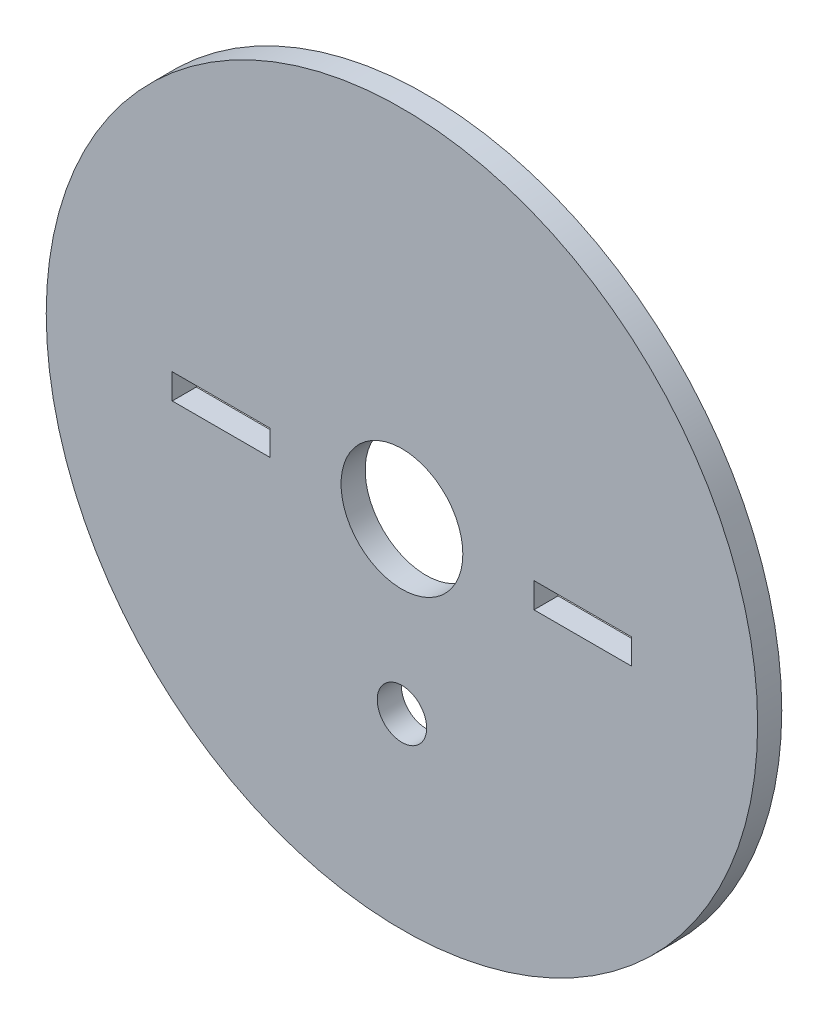
ISO-10303-21;
HEADER;
FILE_DESCRIPTION(('STEP AP214'),'2;1');
FILE_NAME('part.step','',(''),(''),'','','');
FILE_SCHEMA(('AUTOMOTIVE_DESIGN { 1 0 10303 214 1 1 1 1 }'));
ENDSEC;
DATA;
#1=APPLICATION_CONTEXT('core data for automotive mechanical design processes');
#2=APPLICATION_PROTOCOL_DEFINITION('international standard','automotive_design',2000,#1);
#3=PRODUCT_CONTEXT('',#1,'mechanical');
#4=PRODUCT('Part','Part','',(#3));
#5=PRODUCT_RELATED_PRODUCT_CATEGORY('part','',(#4));
#6=PRODUCT_DEFINITION_FORMATION('','',#4);
#7=PRODUCT_DEFINITION_CONTEXT('part definition',#1,'design');
#8=PRODUCT_DEFINITION('design','',#6,#7);
#9=PRODUCT_DEFINITION_SHAPE('','',#8);
#10=(LENGTH_UNIT() NAMED_UNIT(*) SI_UNIT(.MILLI.,.METRE.));
#11=(NAMED_UNIT(*) PLANE_ANGLE_UNIT() SI_UNIT($,.RADIAN.));
#12=(NAMED_UNIT(*) SI_UNIT($,.STERADIAN.) SOLID_ANGLE_UNIT());
#13=UNCERTAINTY_MEASURE_WITH_UNIT(LENGTH_MEASURE(1.E-05),#10,'distance_accuracy_value','');
#14=(GEOMETRIC_REPRESENTATION_CONTEXT(3) GLOBAL_UNCERTAINTY_ASSIGNED_CONTEXT((#13)) GLOBAL_UNIT_ASSIGNED_CONTEXT((#10,
#11,#12)) REPRESENTATION_CONTEXT('',''));
#15=CARTESIAN_POINT('',(0.,0.,0.));
#16=DIRECTION('',(0.,0.,1.));
#17=DIRECTION('',(1.,0.,0.));
#18=AXIS2_PLACEMENT_3D('',#15,#16,#17);
#19=CARTESIAN_POINT('',(0.,14.,2.));
#20=DIRECTION('',(0.,0.,1.));
#21=DIRECTION('',(1.,0.,0.));
#22=AXIS2_PLACEMENT_3D('',#19,#20,#21);
#23=PLANE('',#22);
#24=DIRECTION('',(0.,-1.,0.));
#25=VECTOR('',#24,1.);
#26=CARTESIAN_POINT('',(10.95,15.05,2.));
#27=LINE('',#26,#25);
#28=CARTESIAN_POINT('',(10.95,15.05,2.));
#29=VERTEX_POINT('',#28);
#30=CARTESIAN_POINT('',(10.95,12.95,2.));
#31=VERTEX_POINT('',#30);
#32=EDGE_CURVE('E108',#29,#31,#27,.T.);
#33=ORIENTED_EDGE('',*,*,#32,.F.);
#34=DIRECTION('',(-1.,0.,0.));
#35=VECTOR('',#34,1.);
#36=CARTESIAN_POINT('',(19.05,15.05,2.));
#37=LINE('',#36,#35);
#38=CARTESIAN_POINT('',(19.05,15.05,2.));
#39=VERTEX_POINT('',#38);
#40=EDGE_CURVE('E100',#39,#29,#37,.T.);
#41=ORIENTED_EDGE('',*,*,#40,.F.);
#42=DIRECTION('',(0.,1.,0.));
#43=VECTOR('',#42,1.);
#44=CARTESIAN_POINT('',(19.05,15.05,2.));
#45=LINE('',#44,#43);
#46=CARTESIAN_POINT('',(19.05,12.95,2.));
#47=VERTEX_POINT('',#46);
#48=EDGE_CURVE('E123',#47,#39,#45,.T.);
#49=ORIENTED_EDGE('',*,*,#48,.F.);
#50=DIRECTION('',(1.,0.,0.));
#51=VECTOR('',#50,1.);
#52=CARTESIAN_POINT('',(19.05,12.95,2.));
#53=LINE('',#52,#51);
#54=EDGE_CURVE('E121',#31,#47,#53,.T.);
#55=ORIENTED_EDGE('',*,*,#54,.F.);
#56=EDGE_LOOP('',(#33,#41,#49,#55));
#57=FACE_BOUND('',#56,.T.);
#58=DIRECTION('',(-1.,0.,0.));
#59=VECTOR('',#58,1.);
#60=CARTESIAN_POINT('',(-19.05,15.05,2.));
#61=LINE('',#60,#59);
#62=CARTESIAN_POINT('',(-10.95,15.05,2.));
#63=VERTEX_POINT('',#62);
#64=CARTESIAN_POINT('',(-19.05,15.05,2.));
#65=VERTEX_POINT('',#64);
#66=EDGE_CURVE('E141',#63,#65,#61,.T.);
#67=ORIENTED_EDGE('',*,*,#66,.F.);
#68=DIRECTION('',(0.,1.,0.));
#69=VECTOR('',#68,1.);
#70=CARTESIAN_POINT('',(-10.95,15.05,2.));
#71=LINE('',#70,#69);
#72=CARTESIAN_POINT('',(-10.95,12.95,2.));
#73=VERTEX_POINT('',#72);
#74=EDGE_CURVE('E139',#73,#63,#71,.T.);
#75=ORIENTED_EDGE('',*,*,#74,.F.);
#76=DIRECTION('',(1.,0.,0.));
#77=VECTOR('',#76,1.);
#78=CARTESIAN_POINT('',(-19.05,12.95,2.));
#79=LINE('',#78,#77);
#80=CARTESIAN_POINT('',(-19.05,12.95,2.));
#81=VERTEX_POINT('',#80);
#82=EDGE_CURVE('E147',#81,#73,#79,.T.);
#83=ORIENTED_EDGE('',*,*,#82,.F.);
#84=DIRECTION('',(0.,-1.,0.));
#85=VECTOR('',#84,1.);
#86=CARTESIAN_POINT('',(-19.05,15.05,2.));
#87=LINE('',#86,#85);
#88=EDGE_CURVE('E144',#65,#81,#87,.T.);
#89=ORIENTED_EDGE('',*,*,#88,.F.);
#90=EDGE_LOOP('',(#67,#75,#83,#89));
#91=FACE_BOUND('',#90,.T.);
#92=CARTESIAN_POINT('',(0.,0.,2.));
#93=DIRECTION('',(0.,0.,1.));
#94=DIRECTION('',(1.,0.,0.));
#95=AXIS2_PLACEMENT_3D('',#92,#93,#94);
#96=CIRCLE('',#95,2.05);
#97=CARTESIAN_POINT('',(2.05,0.,2.));
#98=VERTEX_POINT('',#97);
#99=EDGE_CURVE('E170',#98,#98,#96,.T.);
#100=ORIENTED_EDGE('',*,*,#99,.F.);
#101=EDGE_LOOP('',(#100));
#102=FACE_BOUND('',#101,.T.);
#103=CARTESIAN_POINT('',(0.,14.,2.));
#104=DIRECTION('',(0.,0.,1.));
#105=DIRECTION('',(1.,0.,0.));
#106=AXIS2_PLACEMENT_3D('',#103,#104,#105);
#107=CIRCLE('',#106,29.5);
#108=CARTESIAN_POINT('',(29.5,14.,2.));
#109=VERTEX_POINT('',#108);
#110=EDGE_CURVE('E11',#109,#109,#107,.T.);
#111=ORIENTED_EDGE('',*,*,#110,.T.);
#112=EDGE_LOOP('',(#111));
#113=FACE_BOUND('',#112,.T.);
#114=CARTESIAN_POINT('',(0.,14.,2.));
#115=DIRECTION('',(0.,0.,1.));
#116=DIRECTION('',(1.,0.,0.));
#117=AXIS2_PLACEMENT_3D('',#114,#115,#116);
#118=CIRCLE('',#117,5.05);
#119=CARTESIAN_POINT('',(5.05,14.,2.));
#120=VERTEX_POINT('',#119);
#121=EDGE_CURVE('E129',#120,#120,#118,.T.);
#122=ORIENTED_EDGE('',*,*,#121,.F.);
#123=EDGE_LOOP('',(#122));
#124=FACE_BOUND('',#123,.T.);
#125=ADVANCED_FACE('F35',(#57,#91,#102,#113,#124),#23,.T.);
#126=CARTESIAN_POINT('',(0.,14.,0.));
#127=DIRECTION('',(0.,0.,1.));
#128=DIRECTION('',(1.,0.,0.));
#129=AXIS2_PLACEMENT_3D('',#126,#127,#128);
#130=PLANE('',#129);
#131=DIRECTION('',(0.,1.,0.));
#132=VECTOR('',#131,1.);
#133=CARTESIAN_POINT('',(-10.95,15.05,0.));
#134=LINE('',#133,#132);
#135=CARTESIAN_POINT('',(-10.95,12.95,0.));
#136=VERTEX_POINT('',#135);
#137=CARTESIAN_POINT('',(-10.95,15.05,0.));
#138=VERTEX_POINT('',#137);
#139=EDGE_CURVE('E116',#136,#138,#134,.T.);
#140=ORIENTED_EDGE('',*,*,#139,.T.);
#141=DIRECTION('',(-1.,0.,0.));
#142=VECTOR('',#141,1.);
#143=CARTESIAN_POINT('',(-19.05,15.05,0.));
#144=LINE('',#143,#142);
#145=CARTESIAN_POINT('',(-19.05,15.05,0.));
#146=VERTEX_POINT('',#145);
#147=EDGE_CURVE('E152',#138,#146,#144,.T.);
#148=ORIENTED_EDGE('',*,*,#147,.T.);
#149=DIRECTION('',(0.,-1.,0.));
#150=VECTOR('',#149,1.);
#151=CARTESIAN_POINT('',(-19.05,15.05,0.));
#152=LINE('',#151,#150);
#153=CARTESIAN_POINT('',(-19.05,12.95,0.));
#154=VERTEX_POINT('',#153);
#155=EDGE_CURVE('E155',#146,#154,#152,.T.);
#156=ORIENTED_EDGE('',*,*,#155,.T.);
#157=DIRECTION('',(1.,0.,0.));
#158=VECTOR('',#157,1.);
#159=CARTESIAN_POINT('',(-19.05,12.95,0.));
#160=LINE('',#159,#158);
#161=EDGE_CURVE('E142',#154,#136,#160,.T.);
#162=ORIENTED_EDGE('',*,*,#161,.T.);
#163=EDGE_LOOP('',(#140,#148,#156,#162));
#164=FACE_BOUND('',#163,.T.);
#165=CARTESIAN_POINT('',(0.,14.,0.));
#166=DIRECTION('',(0.,0.,1.));
#167=DIRECTION('',(1.,0.,0.));
#168=AXIS2_PLACEMENT_3D('',#165,#166,#167);
#169=CIRCLE('',#168,29.5);
#170=CARTESIAN_POINT('',(29.5,14.,0.));
#171=VERTEX_POINT('',#170);
#172=EDGE_CURVE('E39',#171,#171,#169,.T.);
#173=ORIENTED_EDGE('',*,*,#172,.F.);
#174=EDGE_LOOP('',(#173));
#175=FACE_BOUND('',#174,.T.);
#176=CARTESIAN_POINT('',(0.,0.,0.));
#177=DIRECTION('',(0.,0.,1.));
#178=DIRECTION('',(1.,0.,0.));
#179=AXIS2_PLACEMENT_3D('',#176,#177,#178);
#180=CIRCLE('',#179,2.05);
#181=CARTESIAN_POINT('',(2.05,0.,0.));
#182=VERTEX_POINT('',#181);
#183=EDGE_CURVE('E169',#182,#182,#180,.T.);
#184=ORIENTED_EDGE('',*,*,#183,.T.);
#185=EDGE_LOOP('',(#184));
#186=FACE_BOUND('',#185,.T.);
#187=DIRECTION('',(-1.,0.,0.));
#188=VECTOR('',#187,1.);
#189=CARTESIAN_POINT('',(19.05,15.05,0.));
#190=LINE('',#189,#188);
#191=CARTESIAN_POINT('',(19.05,15.05,0.));
#192=VERTEX_POINT('',#191);
#193=CARTESIAN_POINT('',(10.95,15.05,0.));
#194=VERTEX_POINT('',#193);
#195=EDGE_CURVE('E58',#192,#194,#190,.T.);
#196=ORIENTED_EDGE('',*,*,#195,.T.);
#197=DIRECTION('',(0.,-1.,0.));
#198=VECTOR('',#197,1.);
#199=CARTESIAN_POINT('',(10.95,15.05,0.));
#200=LINE('',#199,#198);
#201=CARTESIAN_POINT('',(10.95,12.95,0.));
#202=VERTEX_POINT('',#201);
#203=EDGE_CURVE('E115',#194,#202,#200,.T.);
#204=ORIENTED_EDGE('',*,*,#203,.T.);
#205=DIRECTION('',(1.,0.,0.));
#206=VECTOR('',#205,1.);
#207=CARTESIAN_POINT('',(19.05,12.95,0.));
#208=LINE('',#207,#206);
#209=CARTESIAN_POINT('',(19.05,12.95,0.));
#210=VERTEX_POINT('',#209);
#211=EDGE_CURVE('E131',#202,#210,#208,.T.);
#212=ORIENTED_EDGE('',*,*,#211,.T.);
#213=DIRECTION('',(0.,1.,0.));
#214=VECTOR('',#213,1.);
#215=CARTESIAN_POINT('',(19.05,15.05,0.));
#216=LINE('',#215,#214);
#217=EDGE_CURVE('E109',#210,#192,#216,.T.);
#218=ORIENTED_EDGE('',*,*,#217,.T.);
#219=EDGE_LOOP('',(#196,#204,#212,#218));
#220=FACE_BOUND('',#219,.T.);
#221=CARTESIAN_POINT('',(0.,14.,0.));
#222=DIRECTION('',(0.,0.,1.));
#223=DIRECTION('',(1.,0.,0.));
#224=AXIS2_PLACEMENT_3D('',#221,#222,#223);
#225=CIRCLE('',#224,5.05);
#226=CARTESIAN_POINT('',(5.05,14.,0.));
#227=VERTEX_POINT('',#226);
#228=EDGE_CURVE('E249',#227,#227,#225,.T.);
#229=ORIENTED_EDGE('',*,*,#228,.T.);
#230=EDGE_LOOP('',(#229));
#231=FACE_BOUND('',#230,.T.);
#232=ADVANCED_FACE('F176',(#164,#175,#186,#220,#231),#130,.F.);
#233=CARTESIAN_POINT('',(0.,14.,2.));
#234=DIRECTION('',(0.,0.,-1.));
#235=DIRECTION('',(-1.,0.,0.));
#236=AXIS2_PLACEMENT_3D('',#233,#234,#235);
#237=CYLINDRICAL_SURFACE('',#236,29.5);
#238=ORIENTED_EDGE('',*,*,#110,.F.);
#239=EDGE_LOOP('',(#238));
#240=FACE_BOUND('',#239,.T.);
#241=ORIENTED_EDGE('',*,*,#172,.T.);
#242=EDGE_LOOP('',(#241));
#243=FACE_BOUND('',#242,.T.);
#244=ADVANCED_FACE('F37',(#240,#243),#237,.T.);
#245=CARTESIAN_POINT('',(0.,0.,2.));
#246=DIRECTION('',(0.,0.,-1.));
#247=DIRECTION('',(-1.,0.,0.));
#248=AXIS2_PLACEMENT_3D('',#245,#246,#247);
#249=CYLINDRICAL_SURFACE('',#248,2.05);
#250=ORIENTED_EDGE('',*,*,#99,.T.);
#251=EDGE_LOOP('',(#250));
#252=FACE_BOUND('',#251,.T.);
#253=ORIENTED_EDGE('',*,*,#183,.F.);
#254=EDGE_LOOP('',(#253));
#255=FACE_BOUND('',#254,.T.);
#256=ADVANCED_FACE('F179',(#252,#255),#249,.F.);
#257=CARTESIAN_POINT('',(-10.95,15.05,2.));
#258=DIRECTION('',(-1.,0.,0.));
#259=DIRECTION('',(0.,0.,1.));
#260=AXIS2_PLACEMENT_3D('',#257,#258,#259);
#261=PLANE('',#260);
#262=ORIENTED_EDGE('',*,*,#139,.F.);
#263=DIRECTION('',(0.,0.,-1.));
#264=VECTOR('',#263,1.);
#265=CARTESIAN_POINT('',(-10.95,12.95,2.));
#266=LINE('',#265,#264);
#267=EDGE_CURVE('E149',#73,#136,#266,.T.);
#268=ORIENTED_EDGE('',*,*,#267,.F.);
#269=ORIENTED_EDGE('',*,*,#74,.T.);
#270=DIRECTION('',(0.,0.,-1.));
#271=VECTOR('',#270,1.);
#272=CARTESIAN_POINT('',(-10.95,15.05,2.));
#273=LINE('',#272,#271);
#274=EDGE_CURVE('E166',#63,#138,#273,.T.);
#275=ORIENTED_EDGE('',*,*,#274,.T.);
#276=EDGE_LOOP('',(#262,#268,#269,#275));
#277=FACE_BOUND('',#276,.T.);
#278=ADVANCED_FACE('F181',(#277),#261,.T.);
#279=CARTESIAN_POINT('',(-19.05,15.05,2.));
#280=DIRECTION('',(0.,-1.,0.));
#281=DIRECTION('',(0.,0.,-1.));
#282=AXIS2_PLACEMENT_3D('',#279,#280,#281);
#283=PLANE('',#282);
#284=ORIENTED_EDGE('',*,*,#147,.F.);
#285=ORIENTED_EDGE('',*,*,#274,.F.);
#286=ORIENTED_EDGE('',*,*,#66,.T.);
#287=DIRECTION('',(0.,0.,-1.));
#288=VECTOR('',#287,1.);
#289=CARTESIAN_POINT('',(-19.05,15.05,2.));
#290=LINE('',#289,#288);
#291=EDGE_CURVE('E164',#65,#146,#290,.T.);
#292=ORIENTED_EDGE('',*,*,#291,.T.);
#293=EDGE_LOOP('',(#284,#285,#286,#292));
#294=FACE_BOUND('',#293,.T.);
#295=ADVANCED_FACE('F188',(#294),#283,.T.);
#296=CARTESIAN_POINT('',(-19.05,15.05,2.));
#297=DIRECTION('',(1.,0.,0.));
#298=DIRECTION('',(0.,0.,-1.));
#299=AXIS2_PLACEMENT_3D('',#296,#297,#298);
#300=PLANE('',#299);
#301=ORIENTED_EDGE('',*,*,#155,.F.);
#302=ORIENTED_EDGE('',*,*,#291,.F.);
#303=ORIENTED_EDGE('',*,*,#88,.T.);
#304=DIRECTION('',(0.,0.,-1.));
#305=VECTOR('',#304,1.);
#306=CARTESIAN_POINT('',(-19.05,12.95,2.));
#307=LINE('',#306,#305);
#308=EDGE_CURVE('E162',#81,#154,#307,.T.);
#309=ORIENTED_EDGE('',*,*,#308,.T.);
#310=EDGE_LOOP('',(#301,#302,#303,#309));
#311=FACE_BOUND('',#310,.T.);
#312=ADVANCED_FACE('F218',(#311),#300,.T.);
#313=CARTESIAN_POINT('',(-19.05,12.95,2.));
#314=DIRECTION('',(0.,1.,0.));
#315=DIRECTION('',(0.,0.,1.));
#316=AXIS2_PLACEMENT_3D('',#313,#314,#315);
#317=PLANE('',#316);
#318=ORIENTED_EDGE('',*,*,#161,.F.);
#319=ORIENTED_EDGE('',*,*,#308,.F.);
#320=ORIENTED_EDGE('',*,*,#82,.T.);
#321=ORIENTED_EDGE('',*,*,#267,.T.);
#322=EDGE_LOOP('',(#318,#319,#320,#321));
#323=FACE_BOUND('',#322,.T.);
#324=ADVANCED_FACE('F209',(#323),#317,.T.);
#325=CARTESIAN_POINT('',(19.05,15.05,2.));
#326=DIRECTION('',(0.,-1.,0.));
#327=DIRECTION('',(0.,0.,-1.));
#328=AXIS2_PLACEMENT_3D('',#325,#326,#327);
#329=PLANE('',#328);
#330=ORIENTED_EDGE('',*,*,#195,.F.);
#331=DIRECTION('',(0.,0.,-1.));
#332=VECTOR('',#331,1.);
#333=CARTESIAN_POINT('',(19.05,15.05,2.));
#334=LINE('',#333,#332);
#335=EDGE_CURVE('E104',#39,#192,#334,.T.);
#336=ORIENTED_EDGE('',*,*,#335,.F.);
#337=ORIENTED_EDGE('',*,*,#40,.T.);
#338=DIRECTION('',(0.,0.,-1.));
#339=VECTOR('',#338,1.);
#340=CARTESIAN_POINT('',(10.95,15.05,2.));
#341=LINE('',#340,#339);
#342=EDGE_CURVE('E103',#29,#194,#341,.T.);
#343=ORIENTED_EDGE('',*,*,#342,.T.);
#344=EDGE_LOOP('',(#330,#336,#337,#343));
#345=FACE_BOUND('',#344,.T.);
#346=ADVANCED_FACE('F102',(#345),#329,.T.);
#347=CARTESIAN_POINT('',(10.95,15.05,2.));
#348=DIRECTION('',(1.,0.,0.));
#349=DIRECTION('',(0.,0.,-1.));
#350=AXIS2_PLACEMENT_3D('',#347,#348,#349);
#351=PLANE('',#350);
#352=ORIENTED_EDGE('',*,*,#203,.F.);
#353=ORIENTED_EDGE('',*,*,#342,.F.);
#354=ORIENTED_EDGE('',*,*,#32,.T.);
#355=DIRECTION('',(0.,0.,-1.));
#356=VECTOR('',#355,1.);
#357=CARTESIAN_POINT('',(10.95,12.95,2.));
#358=LINE('',#357,#356);
#359=EDGE_CURVE('E117',#31,#202,#358,.T.);
#360=ORIENTED_EDGE('',*,*,#359,.T.);
#361=EDGE_LOOP('',(#352,#353,#354,#360));
#362=FACE_BOUND('',#361,.T.);
#363=ADVANCED_FACE('F112',(#362),#351,.T.);
#364=CARTESIAN_POINT('',(19.05,12.95,2.));
#365=DIRECTION('',(0.,1.,0.));
#366=DIRECTION('',(0.,0.,1.));
#367=AXIS2_PLACEMENT_3D('',#364,#365,#366);
#368=PLANE('',#367);
#369=ORIENTED_EDGE('',*,*,#211,.F.);
#370=ORIENTED_EDGE('',*,*,#359,.F.);
#371=ORIENTED_EDGE('',*,*,#54,.T.);
#372=DIRECTION('',(0.,0.,-1.));
#373=VECTOR('',#372,1.);
#374=CARTESIAN_POINT('',(19.05,12.95,2.));
#375=LINE('',#374,#373);
#376=EDGE_CURVE('E50',#47,#210,#375,.T.);
#377=ORIENTED_EDGE('',*,*,#376,.T.);
#378=EDGE_LOOP('',(#369,#370,#371,#377));
#379=FACE_BOUND('',#378,.T.);
#380=ADVANCED_FACE('F232',(#379),#368,.T.);
#381=CARTESIAN_POINT('',(19.05,15.05,2.));
#382=DIRECTION('',(-1.,0.,0.));
#383=DIRECTION('',(0.,0.,1.));
#384=AXIS2_PLACEMENT_3D('',#381,#382,#383);
#385=PLANE('',#384);
#386=ORIENTED_EDGE('',*,*,#217,.F.);
#387=ORIENTED_EDGE('',*,*,#376,.F.);
#388=ORIENTED_EDGE('',*,*,#48,.T.);
#389=ORIENTED_EDGE('',*,*,#335,.T.);
#390=EDGE_LOOP('',(#386,#387,#388,#389));
#391=FACE_BOUND('',#390,.T.);
#392=ADVANCED_FACE('F235',(#391),#385,.T.);
#393=CARTESIAN_POINT('',(0.,14.,2.));
#394=DIRECTION('',(0.,0.,-1.));
#395=DIRECTION('',(-1.,0.,0.));
#396=AXIS2_PLACEMENT_3D('',#393,#394,#395);
#397=CYLINDRICAL_SURFACE('',#396,5.05);
#398=ORIENTED_EDGE('',*,*,#121,.T.);
#399=EDGE_LOOP('',(#398));
#400=FACE_BOUND('',#399,.T.);
#401=ORIENTED_EDGE('',*,*,#228,.F.);
#402=EDGE_LOOP('',(#401));
#403=FACE_BOUND('',#402,.T.);
#404=ADVANCED_FACE('F239',(#400,#403),#397,.F.);
#405=CLOSED_SHELL('',(#125,#232,#244,#256,#278,#295,#312,#324,#346,#363,#380,#392,#404));
#406=MANIFOLD_SOLID_BREP('B2',#405);
#407=ADVANCED_BREP_SHAPE_REPRESENTATION('',(#18,#406),#14);
#408=SHAPE_DEFINITION_REPRESENTATION(#9,#407);
ENDSEC;
END-ISO-10303-21;
